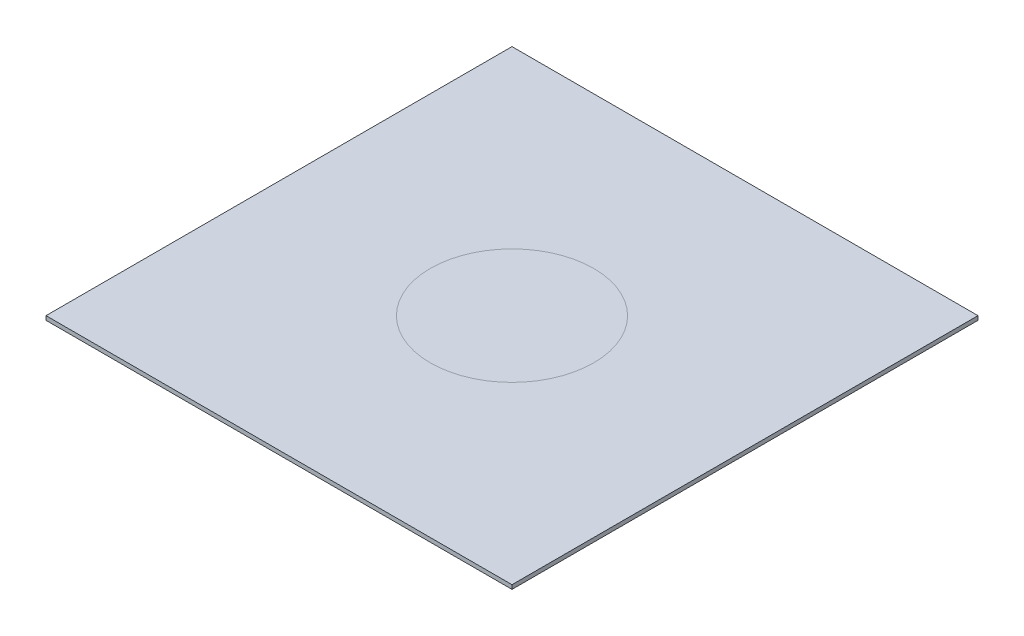
ISO-10303-21;
HEADER;
FILE_DESCRIPTION(('STEP AP214'),'2;1');
FILE_NAME('part.step','',(''),(''),'','','');
FILE_SCHEMA(('AUTOMOTIVE_DESIGN { 1 0 10303 214 1 1 1 1 }'));
ENDSEC;
DATA;
#1=APPLICATION_CONTEXT('core data for automotive mechanical design processes');
#2=APPLICATION_PROTOCOL_DEFINITION('international standard','automotive_design',2000,#1);
#3=PRODUCT_CONTEXT('',#1,'mechanical');
#4=PRODUCT('Part','Part','',(#3));
#5=PRODUCT_RELATED_PRODUCT_CATEGORY('part','',(#4));
#6=PRODUCT_DEFINITION_FORMATION('','',#4);
#7=PRODUCT_DEFINITION_CONTEXT('part definition',#1,'design');
#8=PRODUCT_DEFINITION('design','',#6,#7);
#9=PRODUCT_DEFINITION_SHAPE('','',#8);
#10=(LENGTH_UNIT() NAMED_UNIT(*) SI_UNIT(.MILLI.,.METRE.));
#11=(NAMED_UNIT(*) PLANE_ANGLE_UNIT() SI_UNIT($,.RADIAN.));
#12=(NAMED_UNIT(*) SI_UNIT($,.STERADIAN.) SOLID_ANGLE_UNIT());
#13=UNCERTAINTY_MEASURE_WITH_UNIT(LENGTH_MEASURE(1.E-05),#10,'distance_accuracy_value','');
#14=(GEOMETRIC_REPRESENTATION_CONTEXT(3) GLOBAL_UNCERTAINTY_ASSIGNED_CONTEXT((#13)) GLOBAL_UNIT_ASSIGNED_CONTEXT((#10,
#11,#12)) REPRESENTATION_CONTEXT('',''));
#15=CARTESIAN_POINT('',(0.,0.,0.));
#16=DIRECTION('',(0.,0.,1.));
#17=DIRECTION('',(1.,0.,0.));
#18=AXIS2_PLACEMENT_3D('',#15,#16,#17);
#19=CARTESIAN_POINT('',(0.,0.5,0.));
#20=DIRECTION('',(0.,-1.,0.));
#21=DIRECTION('',(0.,0.,-1.));
#22=AXIS2_PLACEMENT_3D('',#19,#20,#21);
#23=PLANE('',#22);
#24=DIRECTION('',(0.,0.,-1.));
#25=VECTOR('',#24,1.);
#26=CARTESIAN_POINT('',(57.,0.5,57.));
#27=LINE('',#26,#25);
#28=CARTESIAN_POINT('',(57.,0.5,57.));
#29=VERTEX_POINT('',#28);
#30=CARTESIAN_POINT('',(57.,0.5,-57.));
#31=VERTEX_POINT('',#30);
#32=EDGE_CURVE('E89',#29,#31,#27,.T.);
#33=ORIENTED_EDGE('',*,*,#32,.T.);
#34=DIRECTION('',(-1.,0.,0.));
#35=VECTOR('',#34,1.);
#36=CARTESIAN_POINT('',(-57.,0.5,-57.));
#37=LINE('',#36,#35);
#38=CARTESIAN_POINT('',(-57.,0.5,-57.));
#39=VERTEX_POINT('',#38);
#40=EDGE_CURVE('E84',#31,#39,#37,.T.);
#41=ORIENTED_EDGE('',*,*,#40,.T.);
#42=DIRECTION('',(0.,0.,1.));
#43=VECTOR('',#42,1.);
#44=CARTESIAN_POINT('',(-57.,0.5,57.));
#45=LINE('',#44,#43);
#46=CARTESIAN_POINT('',(-57.,0.5,57.));
#47=VERTEX_POINT('',#46);
#48=EDGE_CURVE('E87',#39,#47,#45,.T.);
#49=ORIENTED_EDGE('',*,*,#48,.T.);
#50=DIRECTION('',(1.,0.,0.));
#51=VECTOR('',#50,1.);
#52=CARTESIAN_POINT('',(-57.,0.5,57.));
#53=LINE('',#52,#51);
#54=EDGE_CURVE('E53',#47,#29,#53,.T.);
#55=ORIENTED_EDGE('',*,*,#54,.T.);
#56=EDGE_LOOP('',(#33,#41,#49,#55));
#57=FACE_BOUND('',#56,.T.);
#58=CARTESIAN_POINT('',(0.,0.5,0.));
#59=DIRECTION('',(0.,-1.,0.));
#60=DIRECTION('',(0.,0.,-1.));
#61=AXIS2_PLACEMENT_3D('',#58,#59,#60);
#62=CIRCLE('',#61,20.);
#63=CARTESIAN_POINT('',(0.,0.5,-20.));
#64=VERTEX_POINT('',#63);
#65=EDGE_CURVE('E11',#64,#64,#62,.F.);
#66=ORIENTED_EDGE('',*,*,#65,.F.);
#67=EDGE_LOOP('',(#66));
#68=FACE_BOUND('',#67,.T.);
#69=ADVANCED_FACE('F35',(#57,#68),#23,.F.);
#70=CARTESIAN_POINT('',(57.,0.5,57.));
#71=DIRECTION('',(-1.,0.,0.));
#72=DIRECTION('',(0.,0.,1.));
#73=AXIS2_PLACEMENT_3D('',#70,#71,#72);
#74=PLANE('',#73);
#75=DIRECTION('',(0.,0.,-1.));
#76=VECTOR('',#75,1.);
#77=CARTESIAN_POINT('',(57.,-0.5,57.));
#78=LINE('',#77,#76);
#79=CARTESIAN_POINT('',(57.,-0.5,57.));
#80=VERTEX_POINT('',#79);
#81=CARTESIAN_POINT('',(57.,-0.5,-57.));
#82=VERTEX_POINT('',#81);
#83=EDGE_CURVE('E103',#80,#82,#78,.T.);
#84=ORIENTED_EDGE('',*,*,#83,.T.);
#85=DIRECTION('',(0.,-1.,0.));
#86=VECTOR('',#85,1.);
#87=CARTESIAN_POINT('',(57.,0.5,-57.));
#88=LINE('',#87,#86);
#89=EDGE_CURVE('E45',#31,#82,#88,.T.);
#90=ORIENTED_EDGE('',*,*,#89,.F.);
#91=ORIENTED_EDGE('',*,*,#32,.F.);
#92=DIRECTION('',(0.,-1.,0.));
#93=VECTOR('',#92,1.);
#94=CARTESIAN_POINT('',(57.,0.5,57.));
#95=LINE('',#94,#93);
#96=EDGE_CURVE('E99',#29,#80,#95,.T.);
#97=ORIENTED_EDGE('',*,*,#96,.T.);
#98=EDGE_LOOP('',(#84,#90,#91,#97));
#99=FACE_BOUND('',#98,.T.);
#100=ADVANCED_FACE('F37',(#99),#74,.F.);
#101=CARTESIAN_POINT('',(-57.,0.5,-57.));
#102=DIRECTION('',(0.,0.,1.));
#103=DIRECTION('',(1.,0.,0.));
#104=AXIS2_PLACEMENT_3D('',#101,#102,#103);
#105=PLANE('',#104);
#106=DIRECTION('',(-1.,0.,0.));
#107=VECTOR('',#106,1.);
#108=CARTESIAN_POINT('',(-57.,-0.5,-57.));
#109=LINE('',#108,#107);
#110=CARTESIAN_POINT('',(-57.,-0.5,-57.));
#111=VERTEX_POINT('',#110);
#112=EDGE_CURVE('E94',#82,#111,#109,.T.);
#113=ORIENTED_EDGE('',*,*,#112,.T.);
#114=DIRECTION('',(0.,-1.,0.));
#115=VECTOR('',#114,1.);
#116=CARTESIAN_POINT('',(-57.,0.5,-57.));
#117=LINE('',#116,#115);
#118=EDGE_CURVE('E92',#39,#111,#117,.T.);
#119=ORIENTED_EDGE('',*,*,#118,.F.);
#120=ORIENTED_EDGE('',*,*,#40,.F.);
#121=ORIENTED_EDGE('',*,*,#89,.T.);
#122=EDGE_LOOP('',(#113,#119,#120,#121));
#123=FACE_BOUND('',#122,.T.);
#124=ADVANCED_FACE('F93',(#123),#105,.F.);
#125=CARTESIAN_POINT('',(-57.,0.5,57.));
#126=DIRECTION('',(1.,0.,0.));
#127=DIRECTION('',(0.,0.,-1.));
#128=AXIS2_PLACEMENT_3D('',#125,#126,#127);
#129=PLANE('',#128);
#130=DIRECTION('',(0.,0.,1.));
#131=VECTOR('',#130,1.);
#132=CARTESIAN_POINT('',(-57.,-0.5,57.));
#133=LINE('',#132,#131);
#134=CARTESIAN_POINT('',(-57.,-0.5,57.));
#135=VERTEX_POINT('',#134);
#136=EDGE_CURVE('E70',#111,#135,#133,.T.);
#137=ORIENTED_EDGE('',*,*,#136,.T.);
#138=DIRECTION('',(0.,-1.,0.));
#139=VECTOR('',#138,1.);
#140=CARTESIAN_POINT('',(-57.,0.5,57.));
#141=LINE('',#140,#139);
#142=EDGE_CURVE('E95',#47,#135,#141,.T.);
#143=ORIENTED_EDGE('',*,*,#142,.F.);
#144=ORIENTED_EDGE('',*,*,#48,.F.);
#145=ORIENTED_EDGE('',*,*,#118,.T.);
#146=EDGE_LOOP('',(#137,#143,#144,#145));
#147=FACE_BOUND('',#146,.T.);
#148=ADVANCED_FACE('F97',(#147),#129,.F.);
#149=CARTESIAN_POINT('',(-57.,0.5,57.));
#150=DIRECTION('',(0.,0.,-1.));
#151=DIRECTION('',(-1.,0.,0.));
#152=AXIS2_PLACEMENT_3D('',#149,#150,#151);
#153=PLANE('',#152);
#154=DIRECTION('',(1.,0.,0.));
#155=VECTOR('',#154,1.);
#156=CARTESIAN_POINT('',(-57.,-0.5,57.));
#157=LINE('',#156,#155);
#158=EDGE_CURVE('E76',#135,#80,#157,.T.);
#159=ORIENTED_EDGE('',*,*,#158,.T.);
#160=ORIENTED_EDGE('',*,*,#96,.F.);
#161=ORIENTED_EDGE('',*,*,#54,.F.);
#162=ORIENTED_EDGE('',*,*,#142,.T.);
#163=EDGE_LOOP('',(#159,#160,#161,#162));
#164=FACE_BOUND('',#163,.T.);
#165=ADVANCED_FACE('F120',(#164),#153,.F.);
#166=ORIENTED_EDGE('',*,*,#65,.T.);
#167=EDGE_LOOP('',(#166));
#168=FACE_BOUND('',#167,.T.);
#169=ADVANCED_FACE('F115',(#168),#23,.F.);
#170=CARTESIAN_POINT('',(0.,-0.5,0.));
#171=DIRECTION('',(0.,-1.,0.));
#172=DIRECTION('',(0.,0.,-1.));
#173=AXIS2_PLACEMENT_3D('',#170,#171,#172);
#174=PLANE('',#173);
#175=ORIENTED_EDGE('',*,*,#83,.F.);
#176=ORIENTED_EDGE('',*,*,#158,.F.);
#177=ORIENTED_EDGE('',*,*,#136,.F.);
#178=ORIENTED_EDGE('',*,*,#112,.F.);
#179=EDGE_LOOP('',(#175,#176,#177,#178));
#180=FACE_BOUND('',#179,.T.);
#181=ADVANCED_FACE('F113',(#180),#174,.T.);
#182=CLOSED_SHELL('',(#69,#100,#124,#148,#165,#169,#181));
#183=MANIFOLD_SOLID_BREP('B2',#182);
#184=ADVANCED_BREP_SHAPE_REPRESENTATION('',(#18,#183),#14);
#185=SHAPE_DEFINITION_REPRESENTATION(#9,#184);
ENDSEC;
END-ISO-10303-21;
